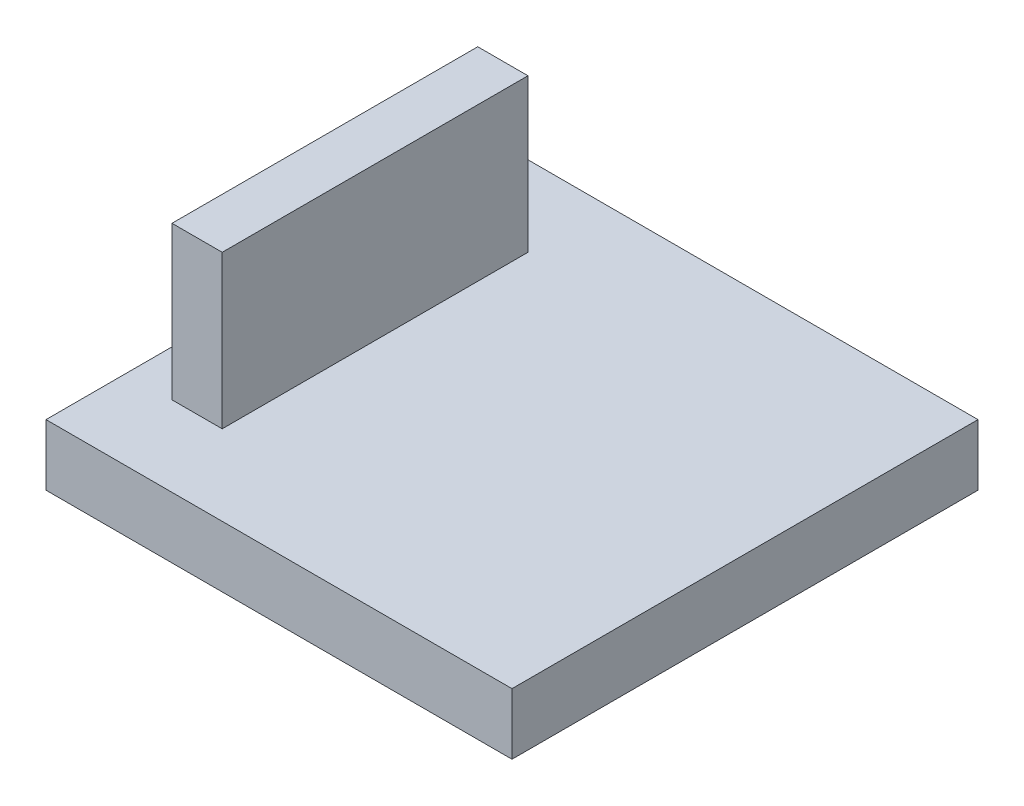
ISO-10303-21;
HEADER;
FILE_DESCRIPTION(('STEP AP214'),'2;1');
FILE_NAME('part.step','',(''),(''),'','','');
FILE_SCHEMA(('AUTOMOTIVE_DESIGN { 1 0 10303 214 1 1 1 1 }'));
ENDSEC;
DATA;
#1=APPLICATION_CONTEXT('core data for automotive mechanical design processes');
#2=APPLICATION_PROTOCOL_DEFINITION('international standard','automotive_design',2000,#1);
#3=PRODUCT_CONTEXT('',#1,'mechanical');
#4=PRODUCT('Part','Part','',(#3));
#5=PRODUCT_RELATED_PRODUCT_CATEGORY('part','',(#4));
#6=PRODUCT_DEFINITION_FORMATION('','',#4);
#7=PRODUCT_DEFINITION_CONTEXT('part definition',#1,'design');
#8=PRODUCT_DEFINITION('design','',#6,#7);
#9=PRODUCT_DEFINITION_SHAPE('','',#8);
#10=(LENGTH_UNIT() NAMED_UNIT(*) SI_UNIT(.MILLI.,.METRE.));
#11=(NAMED_UNIT(*) PLANE_ANGLE_UNIT() SI_UNIT($,.RADIAN.));
#12=(NAMED_UNIT(*) SI_UNIT($,.STERADIAN.) SOLID_ANGLE_UNIT());
#13=UNCERTAINTY_MEASURE_WITH_UNIT(LENGTH_MEASURE(1.E-05),#10,'distance_accuracy_value','');
#14=(GEOMETRIC_REPRESENTATION_CONTEXT(3) GLOBAL_UNCERTAINTY_ASSIGNED_CONTEXT((#13)) GLOBAL_UNIT_ASSIGNED_CONTEXT((#10,
#11,#12)) REPRESENTATION_CONTEXT('',''));
#15=CARTESIAN_POINT('',(0.,0.,0.));
#16=DIRECTION('',(0.,0.,1.));
#17=DIRECTION('',(1.,0.,0.));
#18=AXIS2_PLACEMENT_3D('',#15,#16,#17);
#19=CARTESIAN_POINT('',(0.,2.,0.));
#20=DIRECTION('',(0.,-1.,0.));
#21=DIRECTION('',(0.,0.,-1.));
#22=AXIS2_PLACEMENT_3D('',#19,#20,#21);
#23=PLANE('',#22);
#24=DIRECTION('',(0.,0.,1.));
#25=VECTOR('',#24,1.);
#26=CARTESIAN_POINT('',(0.,2.,0.));
#27=LINE('',#26,#25);
#28=CARTESIAN_POINT('',(0.,2.,-15.24));
#29=VERTEX_POINT('',#28);
#30=CARTESIAN_POINT('',(0.,2.,0.));
#31=VERTEX_POINT('',#30);
#32=EDGE_CURVE('E142',#29,#31,#27,.T.);
#33=ORIENTED_EDGE('',*,*,#32,.T.);
#34=DIRECTION('',(1.,0.,0.));
#35=VECTOR('',#34,1.);
#36=CARTESIAN_POINT('',(0.,2.,0.));
#37=LINE('',#36,#35);
#38=CARTESIAN_POINT('',(15.24,2.,0.));
#39=VERTEX_POINT('',#38);
#40=EDGE_CURVE('E146',#31,#39,#37,.T.);
#41=ORIENTED_EDGE('',*,*,#40,.T.);
#42=DIRECTION('',(0.,0.,-1.));
#43=VECTOR('',#42,1.);
#44=CARTESIAN_POINT('',(15.24,2.,0.));
#45=LINE('',#44,#43);
#46=CARTESIAN_POINT('',(15.24,2.,-15.24));
#47=VERTEX_POINT('',#46);
#48=EDGE_CURVE('E150',#39,#47,#45,.T.);
#49=ORIENTED_EDGE('',*,*,#48,.T.);
#50=DIRECTION('',(-1.,0.,0.));
#51=VECTOR('',#50,1.);
#52=CARTESIAN_POINT('',(0.,2.,-15.24));
#53=LINE('',#52,#51);
#54=EDGE_CURVE('E153',#47,#29,#53,.T.);
#55=ORIENTED_EDGE('',*,*,#54,.T.);
#56=EDGE_LOOP('',(#33,#41,#49,#55));
#57=FACE_BOUND('',#56,.T.);
#58=DIRECTION('',(0.,0.,1.));
#59=VECTOR('',#58,1.);
#60=CARTESIAN_POINT('',(1.5,2.,-12.62));
#61=LINE('',#60,#59);
#62=CARTESIAN_POINT('',(1.5,2.,-12.62));
#63=VERTEX_POINT('',#62);
#64=CARTESIAN_POINT('',(1.5,2.,-2.62));
#65=VERTEX_POINT('',#64);
#66=EDGE_CURVE('E129',#63,#65,#61,.T.);
#67=ORIENTED_EDGE('',*,*,#66,.F.);
#68=DIRECTION('',(-1.,0.,0.));
#69=VECTOR('',#68,1.);
#70=CARTESIAN_POINT('',(1.5,2.,-12.62));
#71=LINE('',#70,#69);
#72=CARTESIAN_POINT('',(3.14262617742162,2.,-12.62));
#73=VERTEX_POINT('',#72);
#74=EDGE_CURVE('E126',#73,#63,#71,.T.);
#75=ORIENTED_EDGE('',*,*,#74,.F.);
#76=DIRECTION('',(0.,0.,-1.));
#77=VECTOR('',#76,1.);
#78=CARTESIAN_POINT('',(3.14262617742162,2.,-12.62));
#79=LINE('',#78,#77);
#80=CARTESIAN_POINT('',(3.14262617742162,2.,-2.62));
#81=VERTEX_POINT('',#80);
#82=EDGE_CURVE('E62',#81,#73,#79,.T.);
#83=ORIENTED_EDGE('',*,*,#82,.F.);
#84=DIRECTION('',(1.,0.,0.));
#85=VECTOR('',#84,1.);
#86=CARTESIAN_POINT('',(1.5,2.,-2.62));
#87=LINE('',#86,#85);
#88=EDGE_CURVE('E57',#65,#81,#87,.T.);
#89=ORIENTED_EDGE('',*,*,#88,.F.);
#90=EDGE_LOOP('',(#67,#75,#83,#89));
#91=FACE_BOUND('',#90,.T.);
#92=ADVANCED_FACE('F41',(#57,#91),#23,.F.);
#93=CARTESIAN_POINT('',(0.,2.,0.));
#94=DIRECTION('',(1.,0.,0.));
#95=DIRECTION('',(0.,0.,-1.));
#96=AXIS2_PLACEMENT_3D('',#93,#94,#95);
#97=PLANE('',#96);
#98=DIRECTION('',(0.,0.,1.));
#99=VECTOR('',#98,1.);
#100=CARTESIAN_POINT('',(0.,0.,0.));
#101=LINE('',#100,#99);
#102=CARTESIAN_POINT('',(0.,0.,-15.24));
#103=VERTEX_POINT('',#102);
#104=CARTESIAN_POINT('',(0.,0.,0.));
#105=VERTEX_POINT('',#104);
#106=EDGE_CURVE('E131',#103,#105,#101,.T.);
#107=ORIENTED_EDGE('',*,*,#106,.T.);
#108=DIRECTION('',(0.,-1.,0.));
#109=VECTOR('',#108,1.);
#110=CARTESIAN_POINT('',(0.,2.,0.));
#111=LINE('',#110,#109);
#112=EDGE_CURVE('E11',#31,#105,#111,.T.);
#113=ORIENTED_EDGE('',*,*,#112,.F.);
#114=ORIENTED_EDGE('',*,*,#32,.F.);
#115=DIRECTION('',(0.,-1.,0.));
#116=VECTOR('',#115,1.);
#117=CARTESIAN_POINT('',(0.,2.,-15.24));
#118=LINE('',#117,#116);
#119=EDGE_CURVE('E155',#29,#103,#118,.T.);
#120=ORIENTED_EDGE('',*,*,#119,.T.);
#121=EDGE_LOOP('',(#107,#113,#114,#120));
#122=FACE_BOUND('',#121,.T.);
#123=ADVANCED_FACE('F43',(#122),#97,.F.);
#124=CARTESIAN_POINT('',(0.,2.,0.));
#125=DIRECTION('',(0.,0.,-1.));
#126=DIRECTION('',(-1.,0.,0.));
#127=AXIS2_PLACEMENT_3D('',#124,#125,#126);
#128=PLANE('',#127);
#129=DIRECTION('',(1.,0.,0.));
#130=VECTOR('',#129,1.);
#131=CARTESIAN_POINT('',(0.,0.,0.));
#132=LINE('',#131,#130);
#133=CARTESIAN_POINT('',(15.24,0.,0.));
#134=VERTEX_POINT('',#133);
#135=EDGE_CURVE('E136',#105,#134,#132,.T.);
#136=ORIENTED_EDGE('',*,*,#135,.T.);
#137=DIRECTION('',(0.,-1.,0.));
#138=VECTOR('',#137,1.);
#139=CARTESIAN_POINT('',(15.24,2.,0.));
#140=LINE('',#139,#138);
#141=EDGE_CURVE('E50',#39,#134,#140,.T.);
#142=ORIENTED_EDGE('',*,*,#141,.F.);
#143=ORIENTED_EDGE('',*,*,#40,.F.);
#144=ORIENTED_EDGE('',*,*,#112,.T.);
#145=EDGE_LOOP('',(#136,#142,#143,#144));
#146=FACE_BOUND('',#145,.T.);
#147=ADVANCED_FACE('F191',(#146),#128,.F.);
#148=CARTESIAN_POINT('',(15.24,2.,0.));
#149=DIRECTION('',(-1.,0.,0.));
#150=DIRECTION('',(0.,0.,1.));
#151=AXIS2_PLACEMENT_3D('',#148,#149,#150);
#152=PLANE('',#151);
#153=DIRECTION('',(0.,0.,-1.));
#154=VECTOR('',#153,1.);
#155=CARTESIAN_POINT('',(15.24,0.,0.));
#156=LINE('',#155,#154);
#157=CARTESIAN_POINT('',(15.24,0.,-15.24));
#158=VERTEX_POINT('',#157);
#159=EDGE_CURVE('E159',#134,#158,#156,.T.);
#160=ORIENTED_EDGE('',*,*,#159,.T.);
#161=DIRECTION('',(0.,-1.,0.));
#162=VECTOR('',#161,1.);
#163=CARTESIAN_POINT('',(15.24,2.,-15.24));
#164=LINE('',#163,#162);
#165=EDGE_CURVE('E167',#47,#158,#164,.T.);
#166=ORIENTED_EDGE('',*,*,#165,.F.);
#167=ORIENTED_EDGE('',*,*,#48,.F.);
#168=ORIENTED_EDGE('',*,*,#141,.T.);
#169=EDGE_LOOP('',(#160,#166,#167,#168));
#170=FACE_BOUND('',#169,.T.);
#171=ADVANCED_FACE('F176',(#170),#152,.F.);
#172=CARTESIAN_POINT('',(0.,2.,-15.24));
#173=DIRECTION('',(0.,0.,1.));
#174=DIRECTION('',(1.,0.,0.));
#175=AXIS2_PLACEMENT_3D('',#172,#173,#174);
#176=PLANE('',#175);
#177=DIRECTION('',(-1.,0.,0.));
#178=VECTOR('',#177,1.);
#179=CARTESIAN_POINT('',(0.,0.,-15.24));
#180=LINE('',#179,#178);
#181=EDGE_CURVE('E147',#158,#103,#180,.T.);
#182=ORIENTED_EDGE('',*,*,#181,.T.);
#183=ORIENTED_EDGE('',*,*,#119,.F.);
#184=ORIENTED_EDGE('',*,*,#54,.F.);
#185=ORIENTED_EDGE('',*,*,#165,.T.);
#186=EDGE_LOOP('',(#182,#183,#184,#185));
#187=FACE_BOUND('',#186,.T.);
#188=ADVANCED_FACE('F185',(#187),#176,.F.);
#189=CARTESIAN_POINT('',(0.,0.,0.));
#190=DIRECTION('',(0.,-1.,0.));
#191=DIRECTION('',(0.,0.,-1.));
#192=AXIS2_PLACEMENT_3D('',#189,#190,#191);
#193=PLANE('',#192);
#194=ORIENTED_EDGE('',*,*,#106,.F.);
#195=ORIENTED_EDGE('',*,*,#181,.F.);
#196=ORIENTED_EDGE('',*,*,#159,.F.);
#197=ORIENTED_EDGE('',*,*,#135,.F.);
#198=EDGE_LOOP('',(#194,#195,#196,#197));
#199=FACE_BOUND('',#198,.T.);
#200=ADVANCED_FACE('F182',(#199),#193,.T.);
#201=CARTESIAN_POINT('',(1.5,7.,-12.62));
#202=DIRECTION('',(1.,0.,0.));
#203=DIRECTION('',(0.,0.,-1.));
#204=AXIS2_PLACEMENT_3D('',#201,#202,#203);
#205=PLANE('',#204);
#206=ORIENTED_EDGE('',*,*,#66,.T.);
#207=DIRECTION('',(0.,-1.,0.));
#208=VECTOR('',#207,1.);
#209=CARTESIAN_POINT('',(1.5,7.,-2.62));
#210=LINE('',#209,#208);
#211=CARTESIAN_POINT('',(1.5,7.,-2.62));
#212=VERTEX_POINT('',#211);
#213=EDGE_CURVE('E108',#212,#65,#210,.T.);
#214=ORIENTED_EDGE('',*,*,#213,.F.);
#215=DIRECTION('',(0.,0.,1.));
#216=VECTOR('',#215,1.);
#217=CARTESIAN_POINT('',(1.5,7.,-12.62));
#218=LINE('',#217,#216);
#219=CARTESIAN_POINT('',(1.5,7.,-12.62));
#220=VERTEX_POINT('',#219);
#221=EDGE_CURVE('E116',#220,#212,#218,.T.);
#222=ORIENTED_EDGE('',*,*,#221,.F.);
#223=DIRECTION('',(0.,-1.,0.));
#224=VECTOR('',#223,1.);
#225=CARTESIAN_POINT('',(1.5,7.,-12.62));
#226=LINE('',#225,#224);
#227=EDGE_CURVE('E286',#220,#63,#226,.T.);
#228=ORIENTED_EDGE('',*,*,#227,.T.);
#229=EDGE_LOOP('',(#206,#214,#222,#228));
#230=FACE_BOUND('',#229,.T.);
#231=ADVANCED_FACE('F128',(#230),#205,.F.);
#232=CARTESIAN_POINT('',(1.5,7.,-2.62));
#233=DIRECTION('',(0.,0.,-1.));
#234=DIRECTION('',(-1.,0.,0.));
#235=AXIS2_PLACEMENT_3D('',#232,#233,#234);
#236=PLANE('',#235);
#237=ORIENTED_EDGE('',*,*,#88,.T.);
#238=DIRECTION('',(0.,-1.,0.));
#239=VECTOR('',#238,1.);
#240=CARTESIAN_POINT('',(3.14262617742162,7.,-2.62));
#241=LINE('',#240,#239);
#242=CARTESIAN_POINT('',(3.14262617742162,7.,-2.62));
#243=VERTEX_POINT('',#242);
#244=EDGE_CURVE('E111',#243,#81,#241,.T.);
#245=ORIENTED_EDGE('',*,*,#244,.F.);
#246=DIRECTION('',(1.,0.,0.));
#247=VECTOR('',#246,1.);
#248=CARTESIAN_POINT('',(1.5,7.,-2.62));
#249=LINE('',#248,#247);
#250=EDGE_CURVE('E104',#212,#243,#249,.T.);
#251=ORIENTED_EDGE('',*,*,#250,.F.);
#252=ORIENTED_EDGE('',*,*,#213,.T.);
#253=EDGE_LOOP('',(#237,#245,#251,#252));
#254=FACE_BOUND('',#253,.T.);
#255=ADVANCED_FACE('F106',(#254),#236,.F.);
#256=CARTESIAN_POINT('',(3.14262617742162,7.,-12.62));
#257=DIRECTION('',(-1.,0.,0.));
#258=DIRECTION('',(0.,0.,1.));
#259=AXIS2_PLACEMENT_3D('',#256,#257,#258);
#260=PLANE('',#259);
#261=ORIENTED_EDGE('',*,*,#82,.T.);
#262=DIRECTION('',(0.,-1.,0.));
#263=VECTOR('',#262,1.);
#264=CARTESIAN_POINT('',(3.14262617742162,7.,-12.62));
#265=LINE('',#264,#263);
#266=CARTESIAN_POINT('',(3.14262617742162,7.,-12.62));
#267=VERTEX_POINT('',#266);
#268=EDGE_CURVE('E138',#267,#73,#265,.T.);
#269=ORIENTED_EDGE('',*,*,#268,.F.);
#270=DIRECTION('',(0.,0.,-1.));
#271=VECTOR('',#270,1.);
#272=CARTESIAN_POINT('',(3.14262617742162,7.,-12.62));
#273=LINE('',#272,#271);
#274=EDGE_CURVE('E115',#243,#267,#273,.T.);
#275=ORIENTED_EDGE('',*,*,#274,.F.);
#276=ORIENTED_EDGE('',*,*,#244,.T.);
#277=EDGE_LOOP('',(#261,#269,#275,#276));
#278=FACE_BOUND('',#277,.T.);
#279=ADVANCED_FACE('F228',(#278),#260,.F.);
#280=CARTESIAN_POINT('',(1.5,7.,-12.62));
#281=DIRECTION('',(0.,0.,1.));
#282=DIRECTION('',(1.,0.,0.));
#283=AXIS2_PLACEMENT_3D('',#280,#281,#282);
#284=PLANE('',#283);
#285=ORIENTED_EDGE('',*,*,#74,.T.);
#286=ORIENTED_EDGE('',*,*,#227,.F.);
#287=DIRECTION('',(-1.,0.,0.));
#288=VECTOR('',#287,1.);
#289=CARTESIAN_POINT('',(1.5,7.,-12.62));
#290=LINE('',#289,#288);
#291=EDGE_CURVE('E121',#267,#220,#290,.T.);
#292=ORIENTED_EDGE('',*,*,#291,.F.);
#293=ORIENTED_EDGE('',*,*,#268,.T.);
#294=EDGE_LOOP('',(#285,#286,#292,#293));
#295=FACE_BOUND('',#294,.T.);
#296=ADVANCED_FACE('F234',(#295),#284,.F.);
#297=CARTESIAN_POINT('',(0.,7.,0.));
#298=DIRECTION('',(0.,1.,0.));
#299=DIRECTION('',(0.,0.,1.));
#300=AXIS2_PLACEMENT_3D('',#297,#298,#299);
#301=PLANE('',#300);
#302=ORIENTED_EDGE('',*,*,#221,.T.);
#303=ORIENTED_EDGE('',*,*,#250,.T.);
#304=ORIENTED_EDGE('',*,*,#274,.T.);
#305=ORIENTED_EDGE('',*,*,#291,.T.);
#306=EDGE_LOOP('',(#302,#303,#304,#305));
#307=FACE_BOUND('',#306,.T.);
#308=ADVANCED_FACE('F119',(#307),#301,.T.);
#309=CLOSED_SHELL('',(#92,#123,#147,#171,#188,#200,#231,#255,#279,#296,#308));
#310=MANIFOLD_SOLID_BREP('B2',#309);
#311=ADVANCED_BREP_SHAPE_REPRESENTATION('',(#18,#310),#14);
#312=SHAPE_DEFINITION_REPRESENTATION(#9,#311);
ENDSEC;
END-ISO-10303-21;
